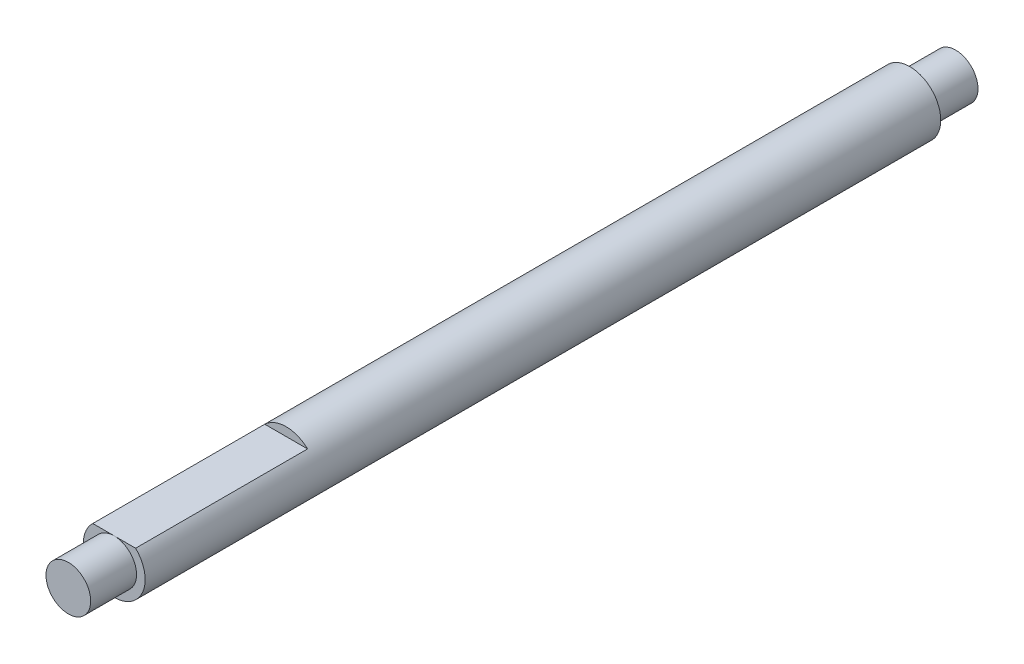
ISO-10303-21;
HEADER;
FILE_DESCRIPTION(('STEP AP214'),'2;1');
FILE_NAME('part.step','',(''),(''),'','','');
FILE_SCHEMA(('AUTOMOTIVE_DESIGN { 1 0 10303 214 1 1 1 1 }'));
ENDSEC;
DATA;
#1=APPLICATION_CONTEXT('core data for automotive mechanical design processes');
#2=APPLICATION_PROTOCOL_DEFINITION('international standard','automotive_design',2000,#1);
#3=PRODUCT_CONTEXT('',#1,'mechanical');
#4=PRODUCT('Part','Part','',(#3));
#5=PRODUCT_RELATED_PRODUCT_CATEGORY('part','',(#4));
#6=PRODUCT_DEFINITION_FORMATION('','',#4);
#7=PRODUCT_DEFINITION_CONTEXT('part definition',#1,'design');
#8=PRODUCT_DEFINITION('design','',#6,#7);
#9=PRODUCT_DEFINITION_SHAPE('','',#8);
#10=(LENGTH_UNIT() NAMED_UNIT(*) SI_UNIT(.MILLI.,.METRE.));
#11=(NAMED_UNIT(*) PLANE_ANGLE_UNIT() SI_UNIT($,.RADIAN.));
#12=(NAMED_UNIT(*) SI_UNIT($,.STERADIAN.) SOLID_ANGLE_UNIT());
#13=UNCERTAINTY_MEASURE_WITH_UNIT(LENGTH_MEASURE(1.E-05),#10,'distance_accuracy_value','');
#14=(GEOMETRIC_REPRESENTATION_CONTEXT(3) GLOBAL_UNCERTAINTY_ASSIGNED_CONTEXT((#13)) GLOBAL_UNIT_ASSIGNED_CONTEXT((#10,
#11,#12)) REPRESENTATION_CONTEXT('',''));
#15=CARTESIAN_POINT('',(0.,0.,0.));
#16=DIRECTION('',(0.,0.,1.));
#17=DIRECTION('',(1.,0.,0.));
#18=AXIS2_PLACEMENT_3D('',#15,#16,#17);
#19=CARTESIAN_POINT('',(0.,0.,0.));
#20=DIRECTION('',(0.,0.,1.));
#21=DIRECTION('',(1.,0.,0.));
#22=AXIS2_PLACEMENT_3D('',#19,#20,#21);
#23=PLANE('',#22);
#24=CARTESIAN_POINT('',(0.,0.,0.));
#25=DIRECTION('',(0.,0.,1.));
#26=DIRECTION('',(1.,0.,0.));
#27=AXIS2_PLACEMENT_3D('',#24,#25,#26);
#28=CIRCLE('',#27,2.7);
#29=CARTESIAN_POINT('',(2.7,0.,0.));
#30=VERTEX_POINT('',#29);
#31=EDGE_CURVE('E78',#30,#30,#28,.T.);
#32=ORIENTED_EDGE('',*,*,#31,.F.);
#33=EDGE_LOOP('',(#32));
#34=FACE_BOUND('',#33,.T.);
#35=CARTESIAN_POINT('',(0.,0.,0.));
#36=DIRECTION('',(0.,0.,1.));
#37=DIRECTION('',(1.,0.,0.));
#38=AXIS2_PLACEMENT_3D('',#35,#36,#37);
#39=CIRCLE('',#38,1.95);
#40=CARTESIAN_POINT('',(1.95,0.,0.));
#41=VERTEX_POINT('',#40);
#42=EDGE_CURVE('E41',#41,#41,#39,.F.);
#43=ORIENTED_EDGE('',*,*,#42,.F.);
#44=EDGE_LOOP('',(#43));
#45=FACE_BOUND('',#44,.T.);
#46=ADVANCED_FACE('F33',(#34,#45),#23,.F.);
#47=CARTESIAN_POINT('',(0.,0.,69.4));
#48=DIRECTION('',(0.,0.,1.));
#49=DIRECTION('',(1.,0.,0.));
#50=AXIS2_PLACEMENT_3D('',#47,#48,#49);
#51=PLANE('',#50);
#52=DIRECTION('',(1.,0.,0.));
#53=VECTOR('',#52,1.);
#54=CARTESIAN_POINT('',(-1.86748493969831,1.95,69.4));
#55=LINE('',#54,#53);
#56=CARTESIAN_POINT('',(-1.86748493969831,1.95,69.4));
#57=VERTEX_POINT('',#56);
#58=CARTESIAN_POINT('',(0.,1.95,69.4));
#59=VERTEX_POINT('',#58);
#60=EDGE_CURVE('E48',#57,#59,#55,.T.);
#61=ORIENTED_EDGE('',*,*,#60,.F.);
#62=CARTESIAN_POINT('',(0.,0.,69.4));
#63=DIRECTION('',(0.,0.,1.));
#64=DIRECTION('',(1.,0.,0.));
#65=AXIS2_PLACEMENT_3D('',#62,#63,#64);
#66=CIRCLE('',#65,2.7);
#67=CARTESIAN_POINT('',(1.86748493969831,1.95,69.4));
#68=VERTEX_POINT('',#67);
#69=EDGE_CURVE('E73',#57,#68,#66,.T.);
#70=ORIENTED_EDGE('',*,*,#69,.T.);
#71=EDGE_CURVE('E61',#59,#68,#55,.T.);
#72=ORIENTED_EDGE('',*,*,#71,.F.);
#73=CARTESIAN_POINT('',(0.,0.,69.4));
#74=DIRECTION('',(0.,0.,1.));
#75=DIRECTION('',(1.,0.,0.));
#76=AXIS2_PLACEMENT_3D('',#73,#74,#75);
#77=CIRCLE('',#76,1.95);
#78=EDGE_CURVE('E85',#59,#59,#77,.T.);
#79=ORIENTED_EDGE('',*,*,#78,.F.);
#80=EDGE_LOOP('',(#61,#70,#72,#79));
#81=FACE_BOUND('',#80,.T.);
#82=ADVANCED_FACE('F77',(#81),#51,.T.);
#83=CARTESIAN_POINT('',(0.,0.,69.4));
#84=DIRECTION('',(0.,0.,-1.));
#85=DIRECTION('',(-1.,0.,0.));
#86=AXIS2_PLACEMENT_3D('',#83,#84,#85);
#87=CYLINDRICAL_SURFACE('',#86,2.7);
#88=CARTESIAN_POINT('',(0.,0.,54.4));
#89=DIRECTION('',(0.,0.,1.));
#90=DIRECTION('',(1.,0.,0.));
#91=AXIS2_PLACEMENT_3D('',#88,#89,#90);
#92=CIRCLE('',#91,2.7);
#93=CARTESIAN_POINT('',(1.86748493969831,1.95,54.4));
#94=VERTEX_POINT('',#93);
#95=CARTESIAN_POINT('',(-1.86748493969831,1.95,54.4));
#96=VERTEX_POINT('',#95);
#97=EDGE_CURVE('E11',#94,#96,#92,.T.);
#98=ORIENTED_EDGE('',*,*,#97,.F.);
#99=DIRECTION('',(0.,0.,1.));
#100=VECTOR('',#99,1.);
#101=CARTESIAN_POINT('',(1.86748493969831,1.95,54.4));
#102=LINE('',#101,#100);
#103=EDGE_CURVE('E64',#94,#68,#102,.T.);
#104=ORIENTED_EDGE('',*,*,#103,.T.);
#105=ORIENTED_EDGE('',*,*,#69,.F.);
#106=DIRECTION('',(0.,0.,1.));
#107=VECTOR('',#106,1.);
#108=CARTESIAN_POINT('',(-1.86748493969831,1.95,54.4));
#109=LINE('',#108,#107);
#110=EDGE_CURVE('E75',#96,#57,#109,.T.);
#111=ORIENTED_EDGE('',*,*,#110,.F.);
#112=EDGE_LOOP('',(#98,#104,#105,#111));
#113=FACE_BOUND('',#112,.T.);
#114=ORIENTED_EDGE('',*,*,#31,.T.);
#115=EDGE_LOOP('',(#114));
#116=FACE_BOUND('',#115,.T.);
#117=ADVANCED_FACE('F35',(#113,#116),#87,.T.);
#118=CARTESIAN_POINT('',(0.,0.,73.4));
#119=DIRECTION('',(0.,0.,-1.));
#120=DIRECTION('',(-1.,0.,0.));
#121=AXIS2_PLACEMENT_3D('',#118,#119,#120);
#122=CYLINDRICAL_SURFACE('',#121,1.95);
#123=CARTESIAN_POINT('',(0.,0.,73.4));
#124=DIRECTION('',(0.,0.,1.));
#125=DIRECTION('',(1.,0.,0.));
#126=AXIS2_PLACEMENT_3D('',#123,#124,#125);
#127=CIRCLE('',#126,1.95);
#128=CARTESIAN_POINT('',(1.95,0.,73.4));
#129=VERTEX_POINT('',#128);
#130=EDGE_CURVE('E82',#129,#129,#127,.T.);
#131=ORIENTED_EDGE('',*,*,#130,.F.);
#132=EDGE_LOOP('',(#131));
#133=FACE_BOUND('',#132,.T.);
#134=ORIENTED_EDGE('',*,*,#78,.T.);
#135=EDGE_LOOP('',(#134));
#136=FACE_BOUND('',#135,.T.);
#137=ADVANCED_FACE('F115',(#133,#136),#122,.T.);
#138=CARTESIAN_POINT('',(0.,0.,73.4));
#139=DIRECTION('',(0.,0.,1.));
#140=DIRECTION('',(1.,0.,0.));
#141=AXIS2_PLACEMENT_3D('',#138,#139,#140);
#142=PLANE('',#141);
#143=ORIENTED_EDGE('',*,*,#130,.T.);
#144=EDGE_LOOP('',(#143));
#145=FACE_BOUND('',#144,.T.);
#146=ADVANCED_FACE('F118',(#145),#142,.T.);
#147=CARTESIAN_POINT('',(0.,0.,-4.));
#148=DIRECTION('',(0.,0.,1.));
#149=DIRECTION('',(1.,0.,0.));
#150=AXIS2_PLACEMENT_3D('',#147,#148,#149);
#151=CYLINDRICAL_SURFACE('',#150,1.95);
#152=CARTESIAN_POINT('',(0.,0.,-4.));
#153=DIRECTION('',(0.,0.,-1.));
#154=DIRECTION('',(-1.,0.,0.));
#155=AXIS2_PLACEMENT_3D('',#152,#153,#154);
#156=CIRCLE('',#155,1.95);
#157=CARTESIAN_POINT('',(-1.95,0.,-4.));
#158=VERTEX_POINT('',#157);
#159=EDGE_CURVE('E74',#158,#158,#156,.T.);
#160=ORIENTED_EDGE('',*,*,#159,.F.);
#161=EDGE_LOOP('',(#160));
#162=FACE_BOUND('',#161,.T.);
#163=ORIENTED_EDGE('',*,*,#42,.T.);
#164=EDGE_LOOP('',(#163));
#165=FACE_BOUND('',#164,.T.);
#166=ADVANCED_FACE('F103',(#162,#165),#151,.T.);
#167=CARTESIAN_POINT('',(0.,0.,-4.));
#168=DIRECTION('',(0.,0.,-1.));
#169=DIRECTION('',(-1.,0.,0.));
#170=AXIS2_PLACEMENT_3D('',#167,#168,#169);
#171=PLANE('',#170);
#172=ORIENTED_EDGE('',*,*,#159,.T.);
#173=EDGE_LOOP('',(#172));
#174=FACE_BOUND('',#173,.T.);
#175=ADVANCED_FACE('F96',(#174),#171,.T.);
#176=CARTESIAN_POINT('',(0.,0.,54.4));
#177=DIRECTION('',(0.,0.,1.));
#178=DIRECTION('',(1.,0.,0.));
#179=AXIS2_PLACEMENT_3D('',#176,#177,#178);
#180=PLANE('',#179);
#181=DIRECTION('',(1.,0.,0.));
#182=VECTOR('',#181,1.);
#183=CARTESIAN_POINT('',(-1.86748493969831,1.95,54.4));
#184=LINE('',#183,#182);
#185=EDGE_CURVE('E91',#96,#94,#184,.T.);
#186=ORIENTED_EDGE('',*,*,#185,.T.);
#187=ORIENTED_EDGE('',*,*,#97,.T.);
#188=EDGE_LOOP('',(#186,#187));
#189=FACE_BOUND('',#188,.T.);
#190=ADVANCED_FACE('F94',(#189),#180,.T.);
#191=CARTESIAN_POINT('',(-1.86748493969831,1.95,54.4));
#192=DIRECTION('',(0.,-1.,0.));
#193=DIRECTION('',(0.,0.,-1.));
#194=AXIS2_PLACEMENT_3D('',#191,#192,#193);
#195=PLANE('',#194);
#196=ORIENTED_EDGE('',*,*,#60,.T.);
#197=ORIENTED_EDGE('',*,*,#71,.T.);
#198=ORIENTED_EDGE('',*,*,#103,.F.);
#199=ORIENTED_EDGE('',*,*,#185,.F.);
#200=ORIENTED_EDGE('',*,*,#110,.T.);
#201=EDGE_LOOP('',(#196,#197,#198,#199,#200));
#202=FACE_BOUND('',#201,.T.);
#203=ADVANCED_FACE('F62',(#202),#195,.F.);
#204=CLOSED_SHELL('',(#46,#82,#117,#137,#146,#166,#175,#190,#203));
#205=MANIFOLD_SOLID_BREP('B2',#204);
#206=ADVANCED_BREP_SHAPE_REPRESENTATION('',(#18,#205),#14);
#207=SHAPE_DEFINITION_REPRESENTATION(#9,#206);
ENDSEC;
END-ISO-10303-21;
